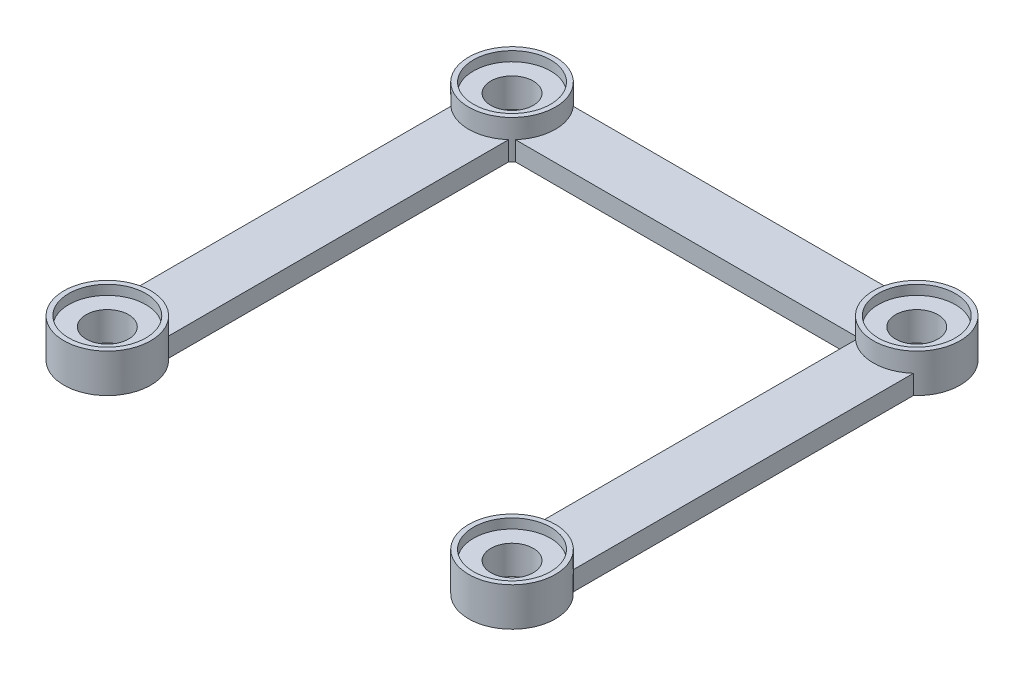
ISO-10303-21;
HEADER;
FILE_DESCRIPTION(('STEP AP214'),'2;1');
FILE_NAME('part.step','',(''),(''),'','','');
FILE_SCHEMA(('AUTOMOTIVE_DESIGN { 1 0 10303 214 1 1 1 1 }'));
ENDSEC;
DATA;
#1=APPLICATION_CONTEXT('core data for automotive mechanical design processes');
#2=APPLICATION_PROTOCOL_DEFINITION('international standard','automotive_design',2000,#1);
#3=PRODUCT_CONTEXT('',#1,'mechanical');
#4=PRODUCT('Part','Part','',(#3));
#5=PRODUCT_RELATED_PRODUCT_CATEGORY('part','',(#4));
#6=PRODUCT_DEFINITION_FORMATION('','',#4);
#7=PRODUCT_DEFINITION_CONTEXT('part definition',#1,'design');
#8=PRODUCT_DEFINITION('design','',#6,#7);
#9=PRODUCT_DEFINITION_SHAPE('','',#8);
#10=(LENGTH_UNIT() NAMED_UNIT(*) SI_UNIT(.MILLI.,.METRE.));
#11=(NAMED_UNIT(*) PLANE_ANGLE_UNIT() SI_UNIT($,.RADIAN.));
#12=(NAMED_UNIT(*) SI_UNIT($,.STERADIAN.) SOLID_ANGLE_UNIT());
#13=UNCERTAINTY_MEASURE_WITH_UNIT(LENGTH_MEASURE(1.E-05),#10,'distance_accuracy_value','');
#14=(GEOMETRIC_REPRESENTATION_CONTEXT(3) GLOBAL_UNCERTAINTY_ASSIGNED_CONTEXT((#13)) GLOBAL_UNIT_ASSIGNED_CONTEXT((#10,
#11,#12)) REPRESENTATION_CONTEXT('',''));
#15=CARTESIAN_POINT('',(0.,0.,0.));
#16=DIRECTION('',(0.,0.,1.));
#17=DIRECTION('',(1.,0.,0.));
#18=AXIS2_PLACEMENT_3D('',#15,#16,#17);
#19=CARTESIAN_POINT('',(9.00000000000001,1.,21.));
#20=DIRECTION('',(1.,0.,0.));
#21=DIRECTION('',(0.,0.,-1.));
#22=AXIS2_PLACEMENT_3D('',#19,#20,#21);
#23=PLANE('',#22);
#24=DIRECTION('',(0.,-1.,0.));
#25=VECTOR('',#24,1.);
#26=CARTESIAN_POINT('',(9.00000000000001,2.,19.3229490168751));
#27=LINE('',#26,#25);
#28=CARTESIAN_POINT('',(9.00000000000001,1.,19.3229490168751));
#29=VERTEX_POINT('',#28);
#30=CARTESIAN_POINT('',(9.00000000000001,0.,19.3229490168751));
#31=VERTEX_POINT('',#30);
#32=EDGE_CURVE('E51',#29,#31,#27,.T.);
#33=ORIENTED_EDGE('',*,*,#32,.F.);
#34=DIRECTION('',(0.,0.,1.));
#35=VECTOR('',#34,1.);
#36=CARTESIAN_POINT('',(9.00000000000001,1.,21.));
#37=LINE('',#36,#35);
#38=CARTESIAN_POINT('',(9.00000000000001,1.,1.67705098312485));
#39=VERTEX_POINT('',#38);
#40=EDGE_CURVE('E236',#39,#29,#37,.T.);
#41=ORIENTED_EDGE('',*,*,#40,.F.);
#42=DIRECTION('',(0.,-1.,0.));
#43=VECTOR('',#42,1.);
#44=CARTESIAN_POINT('',(9.00000000000001,2.,1.67705098312485));
#45=LINE('',#44,#43);
#46=CARTESIAN_POINT('',(9.00000000000001,0.,1.67705098312485));
#47=VERTEX_POINT('',#46);
#48=EDGE_CURVE('E248',#47,#39,#45,.F.);
#49=ORIENTED_EDGE('',*,*,#48,.F.);
#50=DIRECTION('',(0.,0.,1.));
#51=VECTOR('',#50,1.);
#52=CARTESIAN_POINT('',(9.00000000000001,0.,21.));
#53=LINE('',#52,#51);
#54=EDGE_CURVE('E237',#47,#31,#53,.T.);
#55=ORIENTED_EDGE('',*,*,#54,.T.);
#56=EDGE_LOOP('',(#33,#41,#49,#55));
#57=FACE_BOUND('',#56,.T.);
#58=ADVANCED_FACE('F36',(#57),#23,.F.);
#59=CARTESIAN_POINT('',(12.,1.,21.));
#60=DIRECTION('',(-1.,0.,0.));
#61=DIRECTION('',(0.,0.,1.));
#62=AXIS2_PLACEMENT_3D('',#59,#60,#61);
#63=PLANE('',#62);
#64=DIRECTION('',(0.,-1.,0.));
#65=VECTOR('',#64,1.);
#66=CARTESIAN_POINT('',(12.,2.,19.3229490168752));
#67=LINE('',#66,#65);
#68=CARTESIAN_POINT('',(12.,0.,19.3229490168752));
#69=VERTEX_POINT('',#68);
#70=CARTESIAN_POINT('',(12.,1.,19.3229490168752));
#71=VERTEX_POINT('',#70);
#72=EDGE_CURVE('E260',#69,#71,#67,.F.);
#73=ORIENTED_EDGE('',*,*,#72,.F.);
#74=DIRECTION('',(0.,0.,-1.));
#75=VECTOR('',#74,1.);
#76=CARTESIAN_POINT('',(12.,0.,21.));
#77=LINE('',#76,#75);
#78=CARTESIAN_POINT('',(12.,0.,1.67705098312484));
#79=VERTEX_POINT('',#78);
#80=EDGE_CURVE('E234',#69,#79,#77,.T.);
#81=ORIENTED_EDGE('',*,*,#80,.T.);
#82=DIRECTION('',(0.,-1.,0.));
#83=VECTOR('',#82,1.);
#84=CARTESIAN_POINT('',(12.,2.,1.67705098312484));
#85=LINE('',#84,#83);
#86=CARTESIAN_POINT('',(12.,1.,1.67705098312484));
#87=VERTEX_POINT('',#86);
#88=EDGE_CURVE('E11',#87,#79,#85,.T.);
#89=ORIENTED_EDGE('',*,*,#88,.F.);
#90=DIRECTION('',(0.,0.,-1.));
#91=VECTOR('',#90,1.);
#92=CARTESIAN_POINT('',(12.,1.,21.));
#93=LINE('',#92,#91);
#94=EDGE_CURVE('E233',#71,#87,#93,.T.);
#95=ORIENTED_EDGE('',*,*,#94,.F.);
#96=EDGE_LOOP('',(#73,#81,#89,#95));
#97=FACE_BOUND('',#96,.T.);
#98=ADVANCED_FACE('F325',(#97),#63,.F.);
#99=CARTESIAN_POINT('',(-10.5,1.,1.5));
#100=DIRECTION('',(0.,0.,-1.));
#101=DIRECTION('',(-1.,0.,0.));
#102=AXIS2_PLACEMENT_3D('',#99,#100,#101);
#103=PLANE('',#102);
#104=DIRECTION('',(0.,-1.,0.));
#105=VECTOR('',#104,1.);
#106=CARTESIAN_POINT('',(8.82294901687516,2.,1.5));
#107=LINE('',#106,#105);
#108=CARTESIAN_POINT('',(8.82294901687516,1.,1.5));
#109=VERTEX_POINT('',#108);
#110=CARTESIAN_POINT('',(8.82294901687516,0.,1.5));
#111=VERTEX_POINT('',#110);
#112=EDGE_CURVE('E239',#109,#111,#107,.T.);
#113=ORIENTED_EDGE('',*,*,#112,.F.);
#114=DIRECTION('',(1.,0.,0.));
#115=VECTOR('',#114,1.);
#116=CARTESIAN_POINT('',(-10.5,1.,1.5));
#117=LINE('',#116,#115);
#118=CARTESIAN_POINT('',(-8.82294901687516,1.,1.5));
#119=VERTEX_POINT('',#118);
#120=EDGE_CURVE('E167',#119,#109,#117,.T.);
#121=ORIENTED_EDGE('',*,*,#120,.F.);
#122=DIRECTION('',(0.,-1.,0.));
#123=VECTOR('',#122,1.);
#124=CARTESIAN_POINT('',(-8.82294901687516,2.,1.5));
#125=LINE('',#124,#123);
#126=CARTESIAN_POINT('',(-8.82294901687516,0.,1.5));
#127=VERTEX_POINT('',#126);
#128=EDGE_CURVE('E159',#119,#127,#125,.T.);
#129=ORIENTED_EDGE('',*,*,#128,.T.);
#130=DIRECTION('',(1.,0.,0.));
#131=VECTOR('',#130,1.);
#132=CARTESIAN_POINT('',(-10.5,0.,1.5));
#133=LINE('',#132,#131);
#134=EDGE_CURVE('E168',#127,#111,#133,.T.);
#135=ORIENTED_EDGE('',*,*,#134,.T.);
#136=EDGE_LOOP('',(#113,#121,#129,#135));
#137=FACE_BOUND('',#136,.T.);
#138=ADVANCED_FACE('F323',(#137),#103,.F.);
#139=CARTESIAN_POINT('',(0.,1.,0.));
#140=DIRECTION('',(0.,1.,0.));
#141=DIRECTION('',(0.,0.,1.));
#142=AXIS2_PLACEMENT_3D('',#139,#140,#141);
#143=PLANE('',#142);
#144=ORIENTED_EDGE('',*,*,#120,.T.);
#145=CARTESIAN_POINT('',(10.5,1.,0.));
#146=DIRECTION('',(0.,1.,0.));
#147=DIRECTION('',(0.,0.,1.));
#148=AXIS2_PLACEMENT_3D('',#145,#146,#147);
#149=CIRCLE('',#148,2.25);
#150=CARTESIAN_POINT('',(8.82294901687515,1.,-1.5));
#151=VERTEX_POINT('',#150);
#152=EDGE_CURVE('E244',#109,#151,#149,.F.);
#153=ORIENTED_EDGE('',*,*,#152,.T.);
#154=DIRECTION('',(-1.,0.,0.));
#155=VECTOR('',#154,1.);
#156=CARTESIAN_POINT('',(-10.5,1.,-1.5));
#157=LINE('',#156,#155);
#158=CARTESIAN_POINT('',(-8.82294901687515,1.,-1.5));
#159=VERTEX_POINT('',#158);
#160=EDGE_CURVE('E165',#151,#159,#157,.T.);
#161=ORIENTED_EDGE('',*,*,#160,.T.);
#162=CARTESIAN_POINT('',(-10.5,1.,0.));
#163=DIRECTION('',(0.,1.,0.));
#164=DIRECTION('',(0.,0.,1.));
#165=AXIS2_PLACEMENT_3D('',#162,#163,#164);
#166=CIRCLE('',#165,2.25);
#167=EDGE_CURVE('E191',#119,#159,#166,.T.);
#168=ORIENTED_EDGE('',*,*,#167,.F.);
#169=EDGE_LOOP('',(#144,#153,#161,#168));
#170=FACE_BOUND('',#169,.T.);
#171=ADVANCED_FACE('F314',(#170),#143,.T.);
#172=CARTESIAN_POINT('',(-10.5,1.,-1.5));
#173=DIRECTION('',(0.,0.,1.));
#174=DIRECTION('',(1.,0.,0.));
#175=AXIS2_PLACEMENT_3D('',#172,#173,#174);
#176=PLANE('',#175);
#177=DIRECTION('',(0.,-1.,0.));
#178=VECTOR('',#177,1.);
#179=CARTESIAN_POINT('',(8.82294901687515,2.,-1.5));
#180=LINE('',#179,#178);
#181=CARTESIAN_POINT('',(8.82294901687515,0.,-1.5));
#182=VERTEX_POINT('',#181);
#183=EDGE_CURVE('E245',#182,#151,#180,.F.);
#184=ORIENTED_EDGE('',*,*,#183,.F.);
#185=DIRECTION('',(-1.,0.,0.));
#186=VECTOR('',#185,1.);
#187=CARTESIAN_POINT('',(-10.5,0.,-1.5));
#188=LINE('',#187,#186);
#189=CARTESIAN_POINT('',(-8.82294901687515,0.,-1.5));
#190=VERTEX_POINT('',#189);
#191=EDGE_CURVE('E172',#182,#190,#188,.T.);
#192=ORIENTED_EDGE('',*,*,#191,.T.);
#193=DIRECTION('',(0.,-1.,0.));
#194=VECTOR('',#193,1.);
#195=CARTESIAN_POINT('',(-8.82294901687515,2.,-1.5));
#196=LINE('',#195,#194);
#197=EDGE_CURVE('E155',#190,#159,#196,.F.);
#198=ORIENTED_EDGE('',*,*,#197,.T.);
#199=ORIENTED_EDGE('',*,*,#160,.F.);
#200=EDGE_LOOP('',(#184,#192,#198,#199));
#201=FACE_BOUND('',#200,.T.);
#202=ADVANCED_FACE('F38',(#201),#176,.F.);
#203=ORIENTED_EDGE('',*,*,#40,.T.);
#204=CARTESIAN_POINT('',(10.5,1.,21.));
#205=DIRECTION('',(0.,1.,0.));
#206=DIRECTION('',(0.,0.,1.));
#207=AXIS2_PLACEMENT_3D('',#204,#205,#206);
#208=CIRCLE('',#207,2.25);
#209=EDGE_CURVE('E58',#29,#71,#208,.F.);
#210=ORIENTED_EDGE('',*,*,#209,.T.);
#211=ORIENTED_EDGE('',*,*,#94,.T.);
#212=EDGE_CURVE('E251',#87,#39,#149,.F.);
#213=ORIENTED_EDGE('',*,*,#212,.T.);
#214=EDGE_LOOP('',(#203,#210,#211,#213));
#215=FACE_BOUND('',#214,.T.);
#216=ADVANCED_FACE('F317',(#215),#143,.T.);
#217=CARTESIAN_POINT('',(-10.5,1.,21.));
#218=DIRECTION('',(0.,1.,0.));
#219=DIRECTION('',(0.,0.,1.));
#220=AXIS2_PLACEMENT_3D('',#217,#218,#219);
#221=CIRCLE('',#220,2.25);
#222=CARTESIAN_POINT('',(-9.00000000000001,1.,19.3229490168751));
#223=VERTEX_POINT('',#222);
#224=CARTESIAN_POINT('',(-12.,1.,19.3229490168752));
#225=VERTEX_POINT('',#224);
#226=EDGE_CURVE('E146',#223,#225,#221,.T.);
#227=ORIENTED_EDGE('',*,*,#226,.F.);
#228=DIRECTION('',(0.,0.,1.));
#229=VECTOR('',#228,1.);
#230=CARTESIAN_POINT('',(-9.00000000000001,1.,21.));
#231=LINE('',#230,#229);
#232=CARTESIAN_POINT('',(-9.00000000000001,1.,1.67705098312485));
#233=VERTEX_POINT('',#232);
#234=EDGE_CURVE('E144',#233,#223,#231,.T.);
#235=ORIENTED_EDGE('',*,*,#234,.F.);
#236=CARTESIAN_POINT('',(-12.,1.,1.67705098312484));
#237=VERTEX_POINT('',#236);
#238=EDGE_CURVE('E182',#237,#233,#166,.T.);
#239=ORIENTED_EDGE('',*,*,#238,.F.);
#240=DIRECTION('',(0.,0.,-1.));
#241=VECTOR('',#240,1.);
#242=CARTESIAN_POINT('',(-12.,1.,21.));
#243=LINE('',#242,#241);
#244=EDGE_CURVE('E162',#225,#237,#243,.T.);
#245=ORIENTED_EDGE('',*,*,#244,.F.);
#246=EDGE_LOOP('',(#227,#235,#239,#245));
#247=FACE_BOUND('',#246,.T.);
#248=ADVANCED_FACE('F187',(#247),#143,.T.);
#249=CARTESIAN_POINT('',(0.,0.,0.));
#250=DIRECTION('',(0.,1.,0.));
#251=DIRECTION('',(0.,0.,1.));
#252=AXIS2_PLACEMENT_3D('',#249,#250,#251);
#253=PLANE('',#252);
#254=CARTESIAN_POINT('',(10.5,0.,0.));
#255=DIRECTION('',(0.,1.,0.));
#256=DIRECTION('',(0.,0.,1.));
#257=AXIS2_PLACEMENT_3D('',#254,#255,#256);
#258=CIRCLE('',#257,1.1);
#259=CARTESIAN_POINT('',(10.5,0.,1.1));
#260=VERTEX_POINT('',#259);
#261=EDGE_CURVE('E282',#260,#260,#258,.T.);
#262=ORIENTED_EDGE('',*,*,#261,.T.);
#263=EDGE_LOOP('',(#262));
#264=FACE_BOUND('',#263,.T.);
#265=CARTESIAN_POINT('',(10.5,0.,21.));
#266=DIRECTION('',(0.,1.,0.));
#267=DIRECTION('',(0.,0.,1.));
#268=AXIS2_PLACEMENT_3D('',#265,#266,#267);
#269=CIRCLE('',#268,1.1);
#270=CARTESIAN_POINT('',(10.5,0.,22.1));
#271=VERTEX_POINT('',#270);
#272=EDGE_CURVE('E268',#271,#271,#269,.T.);
#273=ORIENTED_EDGE('',*,*,#272,.T.);
#274=EDGE_LOOP('',(#273));
#275=FACE_BOUND('',#274,.T.);
#276=CARTESIAN_POINT('',(10.5,0.,21.));
#277=DIRECTION('',(0.,1.,0.));
#278=DIRECTION('',(0.,0.,-1.));
#279=AXIS2_PLACEMENT_3D('',#276,#277,#278);
#280=CIRCLE('',#279,2.25);
#281=EDGE_CURVE('E265',#31,#69,#280,.T.);
#282=ORIENTED_EDGE('',*,*,#281,.F.);
#283=ORIENTED_EDGE('',*,*,#54,.F.);
#284=CARTESIAN_POINT('',(10.5,0.,0.));
#285=DIRECTION('',(0.,1.,0.));
#286=DIRECTION('',(0.,0.,-1.));
#287=AXIS2_PLACEMENT_3D('',#284,#285,#286);
#288=CIRCLE('',#287,2.25);
#289=EDGE_CURVE('E256',#111,#47,#288,.T.);
#290=ORIENTED_EDGE('',*,*,#289,.F.);
#291=ORIENTED_EDGE('',*,*,#134,.F.);
#292=CARTESIAN_POINT('',(-10.5,0.,0.));
#293=DIRECTION('',(0.,-1.,0.));
#294=DIRECTION('',(0.,0.,-1.));
#295=AXIS2_PLACEMENT_3D('',#292,#293,#294);
#296=CIRCLE('',#295,2.25);
#297=CARTESIAN_POINT('',(-9.00000000000001,0.,1.67705098312485));
#298=VERTEX_POINT('',#297);
#299=EDGE_CURVE('E153',#127,#298,#296,.T.);
#300=ORIENTED_EDGE('',*,*,#299,.T.);
#301=DIRECTION('',(0.,0.,1.));
#302=VECTOR('',#301,1.);
#303=CARTESIAN_POINT('',(-9.00000000000001,0.,21.));
#304=LINE('',#303,#302);
#305=CARTESIAN_POINT('',(-9.00000000000001,0.,19.3229490168751));
#306=VERTEX_POINT('',#305);
#307=EDGE_CURVE('E142',#298,#306,#304,.T.);
#308=ORIENTED_EDGE('',*,*,#307,.T.);
#309=CARTESIAN_POINT('',(-10.5,0.,21.));
#310=DIRECTION('',(0.,-1.,0.));
#311=DIRECTION('',(0.,0.,-1.));
#312=AXIS2_PLACEMENT_3D('',#309,#310,#311);
#313=CIRCLE('',#312,2.25);
#314=CARTESIAN_POINT('',(-12.,0.,19.3229490168752));
#315=VERTEX_POINT('',#314);
#316=EDGE_CURVE('E125',#306,#315,#313,.T.);
#317=ORIENTED_EDGE('',*,*,#316,.T.);
#318=DIRECTION('',(0.,0.,-1.));
#319=VECTOR('',#318,1.);
#320=CARTESIAN_POINT('',(-12.,0.,21.));
#321=LINE('',#320,#319);
#322=CARTESIAN_POINT('',(-12.,0.,1.67705098312484));
#323=VERTEX_POINT('',#322);
#324=EDGE_CURVE('E154',#315,#323,#321,.T.);
#325=ORIENTED_EDGE('',*,*,#324,.T.);
#326=EDGE_CURVE('E145',#323,#190,#296,.T.);
#327=ORIENTED_EDGE('',*,*,#326,.T.);
#328=ORIENTED_EDGE('',*,*,#191,.F.);
#329=EDGE_CURVE('E254',#79,#182,#288,.T.);
#330=ORIENTED_EDGE('',*,*,#329,.F.);
#331=ORIENTED_EDGE('',*,*,#80,.F.);
#332=EDGE_LOOP('',(#282,#283,#290,#291,#300,#308,#317,#325,#327,#328,#330,#331));
#333=FACE_BOUND('',#332,.T.);
#334=CARTESIAN_POINT('',(-10.5,0.,21.));
#335=DIRECTION('',(0.,1.,0.));
#336=DIRECTION('',(0.,0.,1.));
#337=AXIS2_PLACEMENT_3D('',#334,#335,#336);
#338=CIRCLE('',#337,1.1);
#339=CARTESIAN_POINT('',(-10.5,0.,22.1));
#340=VERTEX_POINT('',#339);
#341=EDGE_CURVE('E135',#340,#340,#338,.T.);
#342=ORIENTED_EDGE('',*,*,#341,.T.);
#343=EDGE_LOOP('',(#342));
#344=FACE_BOUND('',#343,.T.);
#345=CARTESIAN_POINT('',(-10.5,0.,0.));
#346=DIRECTION('',(0.,1.,0.));
#347=DIRECTION('',(0.,0.,1.));
#348=AXIS2_PLACEMENT_3D('',#345,#346,#347);
#349=CIRCLE('',#348,1.1);
#350=CARTESIAN_POINT('',(-10.5,0.,1.1));
#351=VERTEX_POINT('',#350);
#352=EDGE_CURVE('E221',#351,#351,#349,.T.);
#353=ORIENTED_EDGE('',*,*,#352,.T.);
#354=EDGE_LOOP('',(#353));
#355=FACE_BOUND('',#354,.T.);
#356=ADVANCED_FACE('F150',(#264,#275,#333,#344,#355),#253,.F.);
#357=CARTESIAN_POINT('',(-9.00000000000001,1.,21.));
#358=DIRECTION('',(1.,0.,0.));
#359=DIRECTION('',(0.,0.,-1.));
#360=AXIS2_PLACEMENT_3D('',#357,#358,#359);
#361=PLANE('',#360);
#362=DIRECTION('',(0.,-1.,0.));
#363=VECTOR('',#362,1.);
#364=CARTESIAN_POINT('',(-9.00000000000001,2.,19.3229490168751));
#365=LINE('',#364,#363);
#366=EDGE_CURVE('E128',#306,#223,#365,.F.);
#367=ORIENTED_EDGE('',*,*,#366,.F.);
#368=ORIENTED_EDGE('',*,*,#307,.F.);
#369=DIRECTION('',(0.,-1.,0.));
#370=VECTOR('',#369,1.);
#371=CARTESIAN_POINT('',(-9.00000000000001,2.,1.67705098312485));
#372=LINE('',#371,#370);
#373=EDGE_CURVE('E188',#233,#298,#372,.T.);
#374=ORIENTED_EDGE('',*,*,#373,.F.);
#375=ORIENTED_EDGE('',*,*,#234,.T.);
#376=EDGE_LOOP('',(#367,#368,#374,#375));
#377=FACE_BOUND('',#376,.T.);
#378=ADVANCED_FACE('F140',(#377),#361,.T.);
#379=CARTESIAN_POINT('',(-12.,1.,21.));
#380=DIRECTION('',(-1.,0.,0.));
#381=DIRECTION('',(0.,0.,1.));
#382=AXIS2_PLACEMENT_3D('',#379,#380,#381);
#383=PLANE('',#382);
#384=DIRECTION('',(0.,-1.,0.));
#385=VECTOR('',#384,1.);
#386=CARTESIAN_POINT('',(-12.,2.,19.3229490168752));
#387=LINE('',#386,#385);
#388=EDGE_CURVE('E44',#225,#315,#387,.T.);
#389=ORIENTED_EDGE('',*,*,#388,.F.);
#390=ORIENTED_EDGE('',*,*,#244,.T.);
#391=DIRECTION('',(0.,-1.,0.));
#392=VECTOR('',#391,1.);
#393=CARTESIAN_POINT('',(-12.,2.,1.67705098312484));
#394=LINE('',#393,#392);
#395=EDGE_CURVE('E171',#323,#237,#394,.F.);
#396=ORIENTED_EDGE('',*,*,#395,.F.);
#397=ORIENTED_EDGE('',*,*,#324,.F.);
#398=EDGE_LOOP('',(#389,#390,#396,#397));
#399=FACE_BOUND('',#398,.T.);
#400=ADVANCED_FACE('F202',(#399),#383,.T.);
#401=CARTESIAN_POINT('',(-10.5,2.,0.));
#402=DIRECTION('',(0.,-1.,0.));
#403=DIRECTION('',(0.,0.,-1.));
#404=AXIS2_PLACEMENT_3D('',#401,#402,#403);
#405=CYLINDRICAL_SURFACE('',#404,2.25);
#406=CARTESIAN_POINT('',(-10.5,2.,0.));
#407=DIRECTION('',(0.,-1.,0.));
#408=DIRECTION('',(0.,0.,-1.));
#409=AXIS2_PLACEMENT_3D('',#406,#407,#408);
#410=CIRCLE('',#409,2.25);
#411=CARTESIAN_POINT('',(-10.5,2.,-2.25));
#412=VERTEX_POINT('',#411);
#413=EDGE_CURVE('E189',#412,#412,#410,.T.);
#414=ORIENTED_EDGE('',*,*,#413,.T.);
#415=EDGE_LOOP('',(#414));
#416=FACE_BOUND('',#415,.T.);
#417=ORIENTED_EDGE('',*,*,#197,.F.);
#418=ORIENTED_EDGE('',*,*,#326,.F.);
#419=ORIENTED_EDGE('',*,*,#395,.T.);
#420=ORIENTED_EDGE('',*,*,#238,.T.);
#421=ORIENTED_EDGE('',*,*,#373,.T.);
#422=ORIENTED_EDGE('',*,*,#299,.F.);
#423=ORIENTED_EDGE('',*,*,#128,.F.);
#424=ORIENTED_EDGE('',*,*,#167,.T.);
#425=EDGE_LOOP('',(#417,#418,#419,#420,#421,#422,#423,#424));
#426=FACE_BOUND('',#425,.T.);
#427=ADVANCED_FACE('F181',(#416,#426),#405,.T.);
#428=CARTESIAN_POINT('',(-10.5,2.,0.));
#429=DIRECTION('',(0.,-1.,0.));
#430=DIRECTION('',(0.,0.,-1.));
#431=AXIS2_PLACEMENT_3D('',#428,#429,#430);
#432=PLANE('',#431);
#433=CARTESIAN_POINT('',(-10.5,2.,0.));
#434=DIRECTION('',(0.,1.,0.));
#435=DIRECTION('',(0.,0.,1.));
#436=AXIS2_PLACEMENT_3D('',#433,#434,#435);
#437=CIRCLE('',#436,1.99999999999999);
#438=CARTESIAN_POINT('',(-10.5,2.,1.99999999999999));
#439=VERTEX_POINT('',#438);
#440=EDGE_CURVE('E230',#439,#439,#437,.T.);
#441=ORIENTED_EDGE('',*,*,#440,.F.);
#442=EDGE_LOOP('',(#441));
#443=FACE_BOUND('',#442,.T.);
#444=ORIENTED_EDGE('',*,*,#413,.F.);
#445=EDGE_LOOP('',(#444));
#446=FACE_BOUND('',#445,.T.);
#447=ADVANCED_FACE('F362',(#443,#446),#432,.F.);
#448=CARTESIAN_POINT('',(-10.5,2.,21.));
#449=DIRECTION('',(0.,-1.,0.));
#450=DIRECTION('',(0.,0.,-1.));
#451=AXIS2_PLACEMENT_3D('',#448,#449,#450);
#452=CYLINDRICAL_SURFACE('',#451,2.25);
#453=CARTESIAN_POINT('',(-10.5,2.,21.));
#454=DIRECTION('',(0.,-1.,0.));
#455=DIRECTION('',(0.,0.,-1.));
#456=AXIS2_PLACEMENT_3D('',#453,#454,#455);
#457=CIRCLE('',#456,2.25);
#458=CARTESIAN_POINT('',(-10.5,2.,18.75));
#459=VERTEX_POINT('',#458);
#460=EDGE_CURVE('E134',#459,#459,#457,.T.);
#461=ORIENTED_EDGE('',*,*,#460,.T.);
#462=EDGE_LOOP('',(#461));
#463=FACE_BOUND('',#462,.T.);
#464=ORIENTED_EDGE('',*,*,#316,.F.);
#465=ORIENTED_EDGE('',*,*,#366,.T.);
#466=ORIENTED_EDGE('',*,*,#226,.T.);
#467=ORIENTED_EDGE('',*,*,#388,.T.);
#468=EDGE_LOOP('',(#464,#465,#466,#467));
#469=FACE_BOUND('',#468,.T.);
#470=ADVANCED_FACE('F127',(#463,#469),#452,.T.);
#471=CARTESIAN_POINT('',(-10.5,2.,21.));
#472=DIRECTION('',(0.,-1.,0.));
#473=DIRECTION('',(0.,0.,-1.));
#474=AXIS2_PLACEMENT_3D('',#471,#472,#473);
#475=PLANE('',#474);
#476=CARTESIAN_POINT('',(-10.5,2.,21.));
#477=DIRECTION('',(0.,1.,0.));
#478=DIRECTION('',(0.,0.,1.));
#479=AXIS2_PLACEMENT_3D('',#476,#477,#478);
#480=CIRCLE('',#479,1.99999999999999);
#481=CARTESIAN_POINT('',(-10.5,2.,23.));
#482=VERTEX_POINT('',#481);
#483=EDGE_CURVE('E218',#482,#482,#480,.T.);
#484=ORIENTED_EDGE('',*,*,#483,.F.);
#485=EDGE_LOOP('',(#484));
#486=FACE_BOUND('',#485,.T.);
#487=ORIENTED_EDGE('',*,*,#460,.F.);
#488=EDGE_LOOP('',(#487));
#489=FACE_BOUND('',#488,.T.);
#490=ADVANCED_FACE('F355',(#486,#489),#475,.F.);
#491=CARTESIAN_POINT('',(-10.5,2.,21.));
#492=DIRECTION('',(0.,1.,0.));
#493=DIRECTION('',(0.,0.,1.));
#494=AXIS2_PLACEMENT_3D('',#491,#492,#493);
#495=CYLINDRICAL_SURFACE('',#494,1.10000000000001);
#496=ORIENTED_EDGE('',*,*,#341,.F.);
#497=EDGE_LOOP('',(#496));
#498=FACE_BOUND('',#497,.T.);
#499=CARTESIAN_POINT('',(-10.5,1.5,21.));
#500=DIRECTION('',(0.,1.,0.));
#501=DIRECTION('',(0.,0.,1.));
#502=AXIS2_PLACEMENT_3D('',#499,#500,#501);
#503=CIRCLE('',#502,1.10000000000001);
#504=CARTESIAN_POINT('',(-10.5,1.5,22.1));
#505=VERTEX_POINT('',#504);
#506=EDGE_CURVE('E212',#505,#505,#503,.T.);
#507=ORIENTED_EDGE('',*,*,#506,.T.);
#508=EDGE_LOOP('',(#507));
#509=FACE_BOUND('',#508,.T.);
#510=ADVANCED_FACE('F351',(#498,#509),#495,.F.);
#511=CARTESIAN_POINT('',(-9.39999999999999,1.5,21.));
#512=DIRECTION('',(0.,-1.,0.));
#513=DIRECTION('',(0.,0.,-1.));
#514=AXIS2_PLACEMENT_3D('',#511,#512,#513);
#515=PLANE('',#514);
#516=ORIENTED_EDGE('',*,*,#506,.F.);
#517=EDGE_LOOP('',(#516));
#518=FACE_BOUND('',#517,.T.);
#519=CARTESIAN_POINT('',(-10.5,1.5,21.));
#520=DIRECTION('',(0.,1.,0.));
#521=DIRECTION('',(0.,0.,1.));
#522=AXIS2_PLACEMENT_3D('',#519,#520,#521);
#523=CIRCLE('',#522,1.99999999999999);
#524=CARTESIAN_POINT('',(-10.5,1.5,23.));
#525=VERTEX_POINT('',#524);
#526=EDGE_CURVE('E215',#525,#525,#523,.T.);
#527=ORIENTED_EDGE('',*,*,#526,.T.);
#528=EDGE_LOOP('',(#527));
#529=FACE_BOUND('',#528,.T.);
#530=ADVANCED_FACE('F347',(#518,#529),#515,.F.);
#531=CARTESIAN_POINT('',(-10.5,2.,21.));
#532=DIRECTION('',(0.,1.,0.));
#533=DIRECTION('',(0.,0.,1.));
#534=AXIS2_PLACEMENT_3D('',#531,#532,#533);
#535=CYLINDRICAL_SURFACE('',#534,1.99999999999999);
#536=ORIENTED_EDGE('',*,*,#526,.F.);
#537=EDGE_LOOP('',(#536));
#538=FACE_BOUND('',#537,.T.);
#539=ORIENTED_EDGE('',*,*,#483,.T.);
#540=EDGE_LOOP('',(#539));
#541=FACE_BOUND('',#540,.T.);
#542=ADVANCED_FACE('F343',(#538,#541),#535,.F.);
#543=CARTESIAN_POINT('',(-10.5,2.,0.));
#544=DIRECTION('',(0.,1.,0.));
#545=DIRECTION('',(0.,0.,1.));
#546=AXIS2_PLACEMENT_3D('',#543,#544,#545);
#547=CYLINDRICAL_SURFACE('',#546,1.10000000000001);
#548=ORIENTED_EDGE('',*,*,#352,.F.);
#549=EDGE_LOOP('',(#548));
#550=FACE_BOUND('',#549,.T.);
#551=CARTESIAN_POINT('',(-10.5,1.5,0.));
#552=DIRECTION('',(0.,1.,0.));
#553=DIRECTION('',(0.,0.,1.));
#554=AXIS2_PLACEMENT_3D('',#551,#552,#553);
#555=CIRCLE('',#554,1.10000000000001);
#556=CARTESIAN_POINT('',(-10.5,1.5,1.10000000000001));
#557=VERTEX_POINT('',#556);
#558=EDGE_CURVE('E224',#557,#557,#555,.T.);
#559=ORIENTED_EDGE('',*,*,#558,.T.);
#560=EDGE_LOOP('',(#559));
#561=FACE_BOUND('',#560,.T.);
#562=ADVANCED_FACE('F339',(#550,#561),#547,.F.);
#563=CARTESIAN_POINT('',(-9.39999999999999,1.5,0.));
#564=DIRECTION('',(0.,-1.,0.));
#565=DIRECTION('',(0.,0.,-1.));
#566=AXIS2_PLACEMENT_3D('',#563,#564,#565);
#567=PLANE('',#566);
#568=ORIENTED_EDGE('',*,*,#558,.F.);
#569=EDGE_LOOP('',(#568));
#570=FACE_BOUND('',#569,.T.);
#571=CARTESIAN_POINT('',(-10.5,1.5,0.));
#572=DIRECTION('',(0.,1.,0.));
#573=DIRECTION('',(0.,0.,1.));
#574=AXIS2_PLACEMENT_3D('',#571,#572,#573);
#575=CIRCLE('',#574,1.99999999999999);
#576=CARTESIAN_POINT('',(-10.5,1.5,1.99999999999999));
#577=VERTEX_POINT('',#576);
#578=EDGE_CURVE('E227',#577,#577,#575,.T.);
#579=ORIENTED_EDGE('',*,*,#578,.T.);
#580=EDGE_LOOP('',(#579));
#581=FACE_BOUND('',#580,.T.);
#582=ADVANCED_FACE('F335',(#570,#581),#567,.F.);
#583=CARTESIAN_POINT('',(-10.5,2.,0.));
#584=DIRECTION('',(0.,1.,0.));
#585=DIRECTION('',(0.,0.,1.));
#586=AXIS2_PLACEMENT_3D('',#583,#584,#585);
#587=CYLINDRICAL_SURFACE('',#586,1.99999999999999);
#588=ORIENTED_EDGE('',*,*,#578,.F.);
#589=EDGE_LOOP('',(#588));
#590=FACE_BOUND('',#589,.T.);
#591=ORIENTED_EDGE('',*,*,#440,.T.);
#592=EDGE_LOOP('',(#591));
#593=FACE_BOUND('',#592,.T.);
#594=ADVANCED_FACE('F307',(#590,#593),#587,.F.);
#595=CARTESIAN_POINT('',(10.5,2.,0.));
#596=DIRECTION('',(0.,-1.,0.));
#597=DIRECTION('',(0.,0.,-1.));
#598=AXIS2_PLACEMENT_3D('',#595,#596,#597);
#599=CYLINDRICAL_SURFACE('',#598,2.25);
#600=CARTESIAN_POINT('',(10.5,2.,0.));
#601=DIRECTION('',(0.,1.,0.));
#602=DIRECTION('',(0.,0.,-1.));
#603=AXIS2_PLACEMENT_3D('',#600,#601,#602);
#604=CIRCLE('',#603,2.25);
#605=CARTESIAN_POINT('',(10.5,2.,-2.25));
#606=VERTEX_POINT('',#605);
#607=EDGE_CURVE('E253',#606,#606,#604,.T.);
#608=ORIENTED_EDGE('',*,*,#607,.F.);
#609=EDGE_LOOP('',(#608));
#610=FACE_BOUND('',#609,.T.);
#611=ORIENTED_EDGE('',*,*,#152,.F.);
#612=ORIENTED_EDGE('',*,*,#112,.T.);
#613=ORIENTED_EDGE('',*,*,#289,.T.);
#614=ORIENTED_EDGE('',*,*,#48,.T.);
#615=ORIENTED_EDGE('',*,*,#212,.F.);
#616=ORIENTED_EDGE('',*,*,#88,.T.);
#617=ORIENTED_EDGE('',*,*,#329,.T.);
#618=ORIENTED_EDGE('',*,*,#183,.T.);
#619=EDGE_LOOP('',(#611,#612,#613,#614,#615,#616,#617,#618));
#620=FACE_BOUND('',#619,.T.);
#621=ADVANCED_FACE('F301',(#610,#620),#599,.T.);
#622=CARTESIAN_POINT('',(10.5,2.,0.));
#623=DIRECTION('',(0.,-1.,0.));
#624=DIRECTION('',(0.,0.,-1.));
#625=AXIS2_PLACEMENT_3D('',#622,#623,#624);
#626=PLANE('',#625);
#627=CARTESIAN_POINT('',(10.5,2.,0.));
#628=DIRECTION('',(0.,1.,0.));
#629=DIRECTION('',(0.,0.,1.));
#630=AXIS2_PLACEMENT_3D('',#627,#628,#629);
#631=CIRCLE('',#630,1.99999999999999);
#632=CARTESIAN_POINT('',(10.5,2.,1.99999999999999));
#633=VERTEX_POINT('',#632);
#634=EDGE_CURVE('E291',#633,#633,#631,.T.);
#635=ORIENTED_EDGE('',*,*,#634,.F.);
#636=EDGE_LOOP('',(#635));
#637=FACE_BOUND('',#636,.T.);
#638=ORIENTED_EDGE('',*,*,#607,.T.);
#639=EDGE_LOOP('',(#638));
#640=FACE_BOUND('',#639,.T.);
#641=ADVANCED_FACE('F297',(#637,#640),#626,.F.);
#642=CARTESIAN_POINT('',(10.5,2.,21.));
#643=DIRECTION('',(0.,-1.,0.));
#644=DIRECTION('',(0.,0.,-1.));
#645=AXIS2_PLACEMENT_3D('',#642,#643,#644);
#646=CYLINDRICAL_SURFACE('',#645,2.25);
#647=CARTESIAN_POINT('',(10.5,2.,21.));
#648=DIRECTION('',(0.,1.,0.));
#649=DIRECTION('',(0.,0.,-1.));
#650=AXIS2_PLACEMENT_3D('',#647,#648,#649);
#651=CIRCLE('',#650,2.25);
#652=CARTESIAN_POINT('',(10.5,2.,18.75));
#653=VERTEX_POINT('',#652);
#654=EDGE_CURVE('E264',#653,#653,#651,.T.);
#655=ORIENTED_EDGE('',*,*,#654,.F.);
#656=EDGE_LOOP('',(#655));
#657=FACE_BOUND('',#656,.T.);
#658=ORIENTED_EDGE('',*,*,#209,.F.);
#659=ORIENTED_EDGE('',*,*,#32,.T.);
#660=ORIENTED_EDGE('',*,*,#281,.T.);
#661=ORIENTED_EDGE('',*,*,#72,.T.);
#662=EDGE_LOOP('',(#658,#659,#660,#661));
#663=FACE_BOUND('',#662,.T.);
#664=ADVANCED_FACE('F300',(#657,#663),#646,.T.);
#665=CARTESIAN_POINT('',(10.5,2.,21.));
#666=DIRECTION('',(0.,-1.,0.));
#667=DIRECTION('',(0.,0.,-1.));
#668=AXIS2_PLACEMENT_3D('',#665,#666,#667);
#669=PLANE('',#668);
#670=CARTESIAN_POINT('',(10.5,2.,21.));
#671=DIRECTION('',(0.,1.,0.));
#672=DIRECTION('',(0.,0.,1.));
#673=AXIS2_PLACEMENT_3D('',#670,#671,#672);
#674=CIRCLE('',#673,1.99999999999999);
#675=CARTESIAN_POINT('',(10.5,2.,23.));
#676=VERTEX_POINT('',#675);
#677=EDGE_CURVE('E279',#676,#676,#674,.T.);
#678=ORIENTED_EDGE('',*,*,#677,.F.);
#679=EDGE_LOOP('',(#678));
#680=FACE_BOUND('',#679,.T.);
#681=ORIENTED_EDGE('',*,*,#654,.T.);
#682=EDGE_LOOP('',(#681));
#683=FACE_BOUND('',#682,.T.);
#684=ADVANCED_FACE('F386',(#680,#683),#669,.F.);
#685=CARTESIAN_POINT('',(10.5,2.,21.));
#686=DIRECTION('',(0.,1.,0.));
#687=DIRECTION('',(0.,0.,1.));
#688=AXIS2_PLACEMENT_3D('',#685,#686,#687);
#689=CYLINDRICAL_SURFACE('',#688,1.10000000000001);
#690=ORIENTED_EDGE('',*,*,#272,.F.);
#691=EDGE_LOOP('',(#690));
#692=FACE_BOUND('',#691,.T.);
#693=CARTESIAN_POINT('',(10.5,1.5,21.));
#694=DIRECTION('',(0.,1.,0.));
#695=DIRECTION('',(0.,0.,1.));
#696=AXIS2_PLACEMENT_3D('',#693,#694,#695);
#697=CIRCLE('',#696,1.10000000000001);
#698=CARTESIAN_POINT('',(10.5,1.5,22.1));
#699=VERTEX_POINT('',#698);
#700=EDGE_CURVE('E273',#699,#699,#697,.T.);
#701=ORIENTED_EDGE('',*,*,#700,.T.);
#702=EDGE_LOOP('',(#701));
#703=FACE_BOUND('',#702,.T.);
#704=ADVANCED_FACE('F392',(#692,#703),#689,.F.);
#705=CARTESIAN_POINT('',(11.6,1.5,21.));
#706=DIRECTION('',(0.,-1.,0.));
#707=DIRECTION('',(0.,0.,-1.));
#708=AXIS2_PLACEMENT_3D('',#705,#706,#707);
#709=PLANE('',#708);
#710=ORIENTED_EDGE('',*,*,#700,.F.);
#711=EDGE_LOOP('',(#710));
#712=FACE_BOUND('',#711,.T.);
#713=CARTESIAN_POINT('',(10.5,1.5,21.));
#714=DIRECTION('',(0.,1.,0.));
#715=DIRECTION('',(0.,0.,1.));
#716=AXIS2_PLACEMENT_3D('',#713,#714,#715);
#717=CIRCLE('',#716,1.99999999999999);
#718=CARTESIAN_POINT('',(10.5,1.5,23.));
#719=VERTEX_POINT('',#718);
#720=EDGE_CURVE('E276',#719,#719,#717,.T.);
#721=ORIENTED_EDGE('',*,*,#720,.T.);
#722=EDGE_LOOP('',(#721));
#723=FACE_BOUND('',#722,.T.);
#724=ADVANCED_FACE('F399',(#712,#723),#709,.F.);
#725=CARTESIAN_POINT('',(10.5,2.,21.));
#726=DIRECTION('',(0.,1.,0.));
#727=DIRECTION('',(0.,0.,1.));
#728=AXIS2_PLACEMENT_3D('',#725,#726,#727);
#729=CYLINDRICAL_SURFACE('',#728,1.99999999999999);
#730=ORIENTED_EDGE('',*,*,#720,.F.);
#731=EDGE_LOOP('',(#730));
#732=FACE_BOUND('',#731,.T.);
#733=ORIENTED_EDGE('',*,*,#677,.T.);
#734=EDGE_LOOP('',(#733));
#735=FACE_BOUND('',#734,.T.);
#736=ADVANCED_FACE('F403',(#732,#735),#729,.F.);
#737=CARTESIAN_POINT('',(10.5,2.,0.));
#738=DIRECTION('',(0.,1.,0.));
#739=DIRECTION('',(0.,0.,1.));
#740=AXIS2_PLACEMENT_3D('',#737,#738,#739);
#741=CYLINDRICAL_SURFACE('',#740,1.10000000000001);
#742=ORIENTED_EDGE('',*,*,#261,.F.);
#743=EDGE_LOOP('',(#742));
#744=FACE_BOUND('',#743,.T.);
#745=CARTESIAN_POINT('',(10.5,1.5,0.));
#746=DIRECTION('',(0.,1.,0.));
#747=DIRECTION('',(0.,0.,1.));
#748=AXIS2_PLACEMENT_3D('',#745,#746,#747);
#749=CIRCLE('',#748,1.10000000000001);
#750=CARTESIAN_POINT('',(10.5,1.5,1.10000000000001));
#751=VERTEX_POINT('',#750);
#752=EDGE_CURVE('E285',#751,#751,#749,.T.);
#753=ORIENTED_EDGE('',*,*,#752,.T.);
#754=EDGE_LOOP('',(#753));
#755=FACE_BOUND('',#754,.T.);
#756=ADVANCED_FACE('F407',(#744,#755),#741,.F.);
#757=CARTESIAN_POINT('',(11.6,1.5,0.));
#758=DIRECTION('',(0.,-1.,0.));
#759=DIRECTION('',(0.,0.,-1.));
#760=AXIS2_PLACEMENT_3D('',#757,#758,#759);
#761=PLANE('',#760);
#762=ORIENTED_EDGE('',*,*,#752,.F.);
#763=EDGE_LOOP('',(#762));
#764=FACE_BOUND('',#763,.T.);
#765=CARTESIAN_POINT('',(10.5,1.5,0.));
#766=DIRECTION('',(0.,1.,0.));
#767=DIRECTION('',(0.,0.,1.));
#768=AXIS2_PLACEMENT_3D('',#765,#766,#767);
#769=CIRCLE('',#768,1.99999999999999);
#770=CARTESIAN_POINT('',(10.5,1.5,1.99999999999999));
#771=VERTEX_POINT('',#770);
#772=EDGE_CURVE('E288',#771,#771,#769,.T.);
#773=ORIENTED_EDGE('',*,*,#772,.T.);
#774=EDGE_LOOP('',(#773));
#775=FACE_BOUND('',#774,.T.);
#776=ADVANCED_FACE('F411',(#764,#775),#761,.F.);
#777=CARTESIAN_POINT('',(10.5,2.,0.));
#778=DIRECTION('',(0.,1.,0.));
#779=DIRECTION('',(0.,0.,1.));
#780=AXIS2_PLACEMENT_3D('',#777,#778,#779);
#781=CYLINDRICAL_SURFACE('',#780,1.99999999999999);
#782=ORIENTED_EDGE('',*,*,#772,.F.);
#783=EDGE_LOOP('',(#782));
#784=FACE_BOUND('',#783,.T.);
#785=ORIENTED_EDGE('',*,*,#634,.T.);
#786=EDGE_LOOP('',(#785));
#787=FACE_BOUND('',#786,.T.);
#788=ADVANCED_FACE('F295',(#784,#787),#781,.F.);
#789=CLOSED_SHELL('',(#58,#98,#138,#171,#202,#216,#248,#356,#378,#400,#427,#447,#470,#490,#510,
#530,#542,#562,#582,#594,#621,#641,#664,#684,#704,#724,#736,#756,#776,#788));
#790=MANIFOLD_SOLID_BREP('B2',#789);
#791=ADVANCED_BREP_SHAPE_REPRESENTATION('',(#18,#790),#14);
#792=SHAPE_DEFINITION_REPRESENTATION(#9,#791);
ENDSEC;
END-ISO-10303-21;
